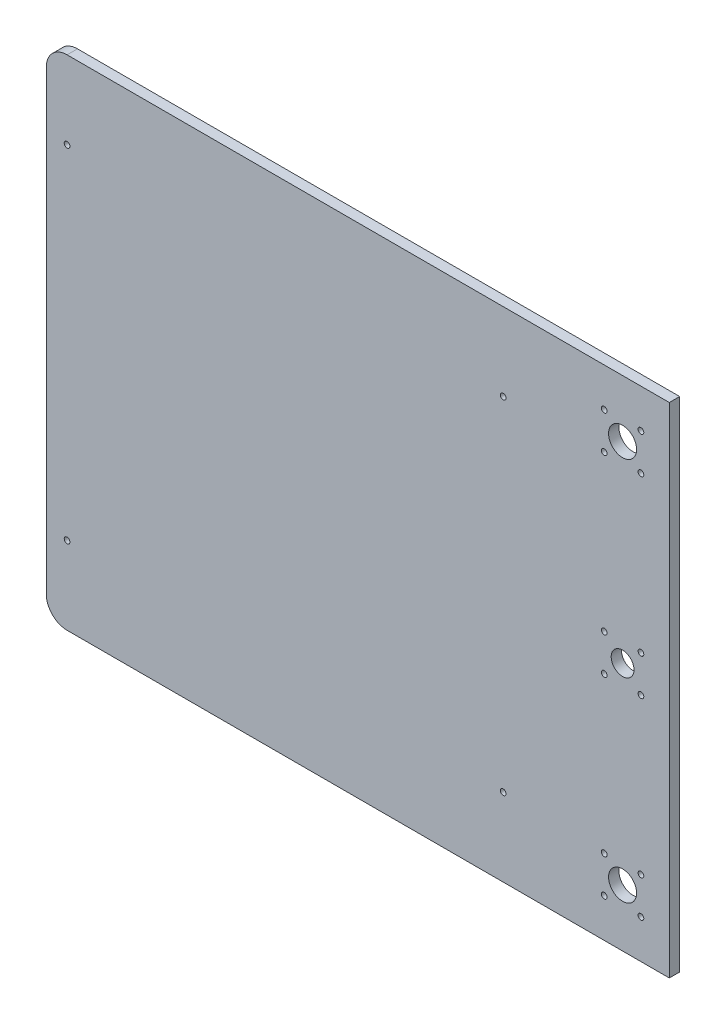
ISO-10303-21;
HEADER;
FILE_DESCRIPTION(('STEP AP214'),'2;1');
FILE_NAME('part.step','',(''),(''),'','','');
FILE_SCHEMA(('AUTOMOTIVE_DESIGN { 1 0 10303 214 1 1 1 1 }'));
ENDSEC;
DATA;
#1=APPLICATION_CONTEXT('core data for automotive mechanical design processes');
#2=APPLICATION_PROTOCOL_DEFINITION('international standard','automotive_design',2000,#1);
#3=PRODUCT_CONTEXT('',#1,'mechanical');
#4=PRODUCT('Part','Part','',(#3));
#5=PRODUCT_RELATED_PRODUCT_CATEGORY('part','',(#4));
#6=PRODUCT_DEFINITION_FORMATION('','',#4);
#7=PRODUCT_DEFINITION_CONTEXT('part definition',#1,'design');
#8=PRODUCT_DEFINITION('design','',#6,#7);
#9=PRODUCT_DEFINITION_SHAPE('','',#8);
#10=(LENGTH_UNIT() NAMED_UNIT(*) SI_UNIT(.MILLI.,.METRE.));
#11=(NAMED_UNIT(*) PLANE_ANGLE_UNIT() SI_UNIT($,.RADIAN.));
#12=(NAMED_UNIT(*) SI_UNIT($,.STERADIAN.) SOLID_ANGLE_UNIT());
#13=UNCERTAINTY_MEASURE_WITH_UNIT(LENGTH_MEASURE(1.E-05),#10,'distance_accuracy_value','');
#14=(GEOMETRIC_REPRESENTATION_CONTEXT(3) GLOBAL_UNCERTAINTY_ASSIGNED_CONTEXT((#13)) GLOBAL_UNIT_ASSIGNED_CONTEXT((#10,
#11,#12)) REPRESENTATION_CONTEXT('',''));
#15=CARTESIAN_POINT('',(0.,0.,0.));
#16=DIRECTION('',(0.,0.,1.));
#17=DIRECTION('',(1.,0.,0.));
#18=AXIS2_PLACEMENT_3D('',#15,#16,#17);
#19=CARTESIAN_POINT('',(45.,0.,10.));
#20=DIRECTION('',(1.,0.,0.));
#21=DIRECTION('',(0.,0.,-1.));
#22=AXIS2_PLACEMENT_3D('',#19,#20,#21);
#23=PLANE('',#22);
#24=DIRECTION('',(0.,-1.,0.));
#25=VECTOR('',#24,1.);
#26=CARTESIAN_POINT('',(45.,0.,0.));
#27=LINE('',#26,#25);
#28=CARTESIAN_POINT('',(45.,240.,0.));
#29=VERTEX_POINT('',#28);
#30=CARTESIAN_POINT('',(45.,-240.,0.));
#31=VERTEX_POINT('',#30);
#32=EDGE_CURVE('E115',#29,#31,#27,.T.);
#33=ORIENTED_EDGE('',*,*,#32,.F.);
#34=DIRECTION('',(0.,0.,-1.));
#35=VECTOR('',#34,1.);
#36=CARTESIAN_POINT('',(45.,240.,10.));
#37=LINE('',#36,#35);
#38=CARTESIAN_POINT('',(45.,240.,10.));
#39=VERTEX_POINT('',#38);
#40=EDGE_CURVE('E104',#39,#29,#37,.T.);
#41=ORIENTED_EDGE('',*,*,#40,.F.);
#42=DIRECTION('',(0.,-1.,0.));
#43=VECTOR('',#42,1.);
#44=CARTESIAN_POINT('',(45.,0.,10.));
#45=LINE('',#44,#43);
#46=CARTESIAN_POINT('',(45.,-240.,10.));
#47=VERTEX_POINT('',#46);
#48=EDGE_CURVE('E109',#39,#47,#45,.T.);
#49=ORIENTED_EDGE('',*,*,#48,.T.);
#50=DIRECTION('',(0.,0.,-1.));
#51=VECTOR('',#50,1.);
#52=CARTESIAN_POINT('',(45.,-240.,10.));
#53=LINE('',#52,#51);
#54=EDGE_CURVE('E117',#47,#31,#53,.T.);
#55=ORIENTED_EDGE('',*,*,#54,.T.);
#56=EDGE_LOOP('',(#33,#41,#49,#55));
#57=FACE_BOUND('',#56,.T.);
#58=ADVANCED_FACE('F48',(#57),#23,.T.);
#59=CARTESIAN_POINT('',(0.,240.,10.));
#60=DIRECTION('',(0.,1.,0.));
#61=DIRECTION('',(0.,0.,1.));
#62=AXIS2_PLACEMENT_3D('',#59,#60,#61);
#63=PLANE('',#62);
#64=DIRECTION('',(1.,0.,0.));
#65=VECTOR('',#64,1.);
#66=CARTESIAN_POINT('',(0.,240.,0.));
#67=LINE('',#66,#65);
#68=CARTESIAN_POINT('',(-535.,240.,-1.11022302462516E-13));
#69=VERTEX_POINT('',#68);
#70=EDGE_CURVE('E190',#69,#29,#67,.T.);
#71=ORIENTED_EDGE('',*,*,#70,.F.);
#72=DIRECTION('',(0.,0.,-1.));
#73=VECTOR('',#72,1.);
#74=CARTESIAN_POINT('',(-535.,240.,9.9999999999999));
#75=LINE('',#74,#73);
#76=CARTESIAN_POINT('',(-535.,240.,9.9999999999999));
#77=VERTEX_POINT('',#76);
#78=EDGE_CURVE('E71',#69,#77,#75,.F.);
#79=ORIENTED_EDGE('',*,*,#78,.T.);
#80=DIRECTION('',(1.,0.,0.));
#81=VECTOR('',#80,1.);
#82=CARTESIAN_POINT('',(0.,240.,10.));
#83=LINE('',#82,#81);
#84=EDGE_CURVE('E101',#77,#39,#83,.T.);
#85=ORIENTED_EDGE('',*,*,#84,.T.);
#86=ORIENTED_EDGE('',*,*,#40,.T.);
#87=EDGE_LOOP('',(#71,#79,#85,#86));
#88=FACE_BOUND('',#87,.T.);
#89=ADVANCED_FACE('F103',(#88),#63,.T.);
#90=CARTESIAN_POINT('',(-555.,0.,9.9999999999999));
#91=DIRECTION('',(1.,0.,0.));
#92=DIRECTION('',(0.,0.,-1.));
#93=AXIS2_PLACEMENT_3D('',#90,#91,#92);
#94=PLANE('',#93);
#95=DIRECTION('',(0.,-1.,0.));
#96=VECTOR('',#95,1.);
#97=CARTESIAN_POINT('',(-555.,0.,9.9999999999999));
#98=LINE('',#97,#96);
#99=CARTESIAN_POINT('',(-555.,220.,9.99999999999995));
#100=VERTEX_POINT('',#99);
#101=CARTESIAN_POINT('',(-555.,-220.,9.9999999999999));
#102=VERTEX_POINT('',#101);
#103=EDGE_CURVE('E108',#100,#102,#98,.T.);
#104=ORIENTED_EDGE('',*,*,#103,.F.);
#105=DIRECTION('',(0.,0.,-1.));
#106=VECTOR('',#105,1.);
#107=CARTESIAN_POINT('',(-555.,220.,0.));
#108=LINE('',#107,#106);
#109=CARTESIAN_POINT('',(-555.,220.,0.));
#110=VERTEX_POINT('',#109);
#111=EDGE_CURVE('E242',#100,#110,#108,.T.);
#112=ORIENTED_EDGE('',*,*,#111,.T.);
#113=DIRECTION('',(0.,-1.,0.));
#114=VECTOR('',#113,1.);
#115=CARTESIAN_POINT('',(-555.,0.,-1.11022302462516E-13));
#116=LINE('',#115,#114);
#117=CARTESIAN_POINT('',(-555.,-220.,-1.11022302462516E-13));
#118=VERTEX_POINT('',#117);
#119=EDGE_CURVE('E192',#110,#118,#116,.T.);
#120=ORIENTED_EDGE('',*,*,#119,.T.);
#121=DIRECTION('',(0.,0.,-1.));
#122=VECTOR('',#121,1.);
#123=CARTESIAN_POINT('',(-555.,-220.,9.9999999999999));
#124=LINE('',#123,#122);
#125=EDGE_CURVE('E116',#118,#102,#124,.F.);
#126=ORIENTED_EDGE('',*,*,#125,.T.);
#127=EDGE_LOOP('',(#104,#112,#120,#126));
#128=FACE_BOUND('',#127,.T.);
#129=ADVANCED_FACE('F254',(#128),#94,.F.);
#130=CARTESIAN_POINT('',(-2.22044604925031E-13,-185.,9.99999999999995));
#131=DIRECTION('',(0.,0.,-1.));
#132=DIRECTION('',(-1.,0.,0.));
#133=AXIS2_PLACEMENT_3D('',#130,#131,#132);
#134=CYLINDRICAL_SURFACE('',#133,13.5);
#135=CARTESIAN_POINT('',(-2.22044604925031E-13,-185.,9.99999999999995));
#136=DIRECTION('',(0.,0.,1.));
#137=DIRECTION('',(1.,0.,0.));
#138=AXIS2_PLACEMENT_3D('',#135,#136,#137);
#139=CIRCLE('',#138,13.5);
#140=CARTESIAN_POINT('',(13.4999999999998,-185.,9.99999999999995));
#141=VERTEX_POINT('',#140);
#142=EDGE_CURVE('E168',#141,#141,#139,.F.);
#143=ORIENTED_EDGE('',*,*,#142,.F.);
#144=EDGE_LOOP('',(#143));
#145=FACE_BOUND('',#144,.T.);
#146=CARTESIAN_POINT('',(-2.22044604925031E-13,-185.,0.));
#147=DIRECTION('',(0.,0.,1.));
#148=DIRECTION('',(1.,0.,0.));
#149=AXIS2_PLACEMENT_3D('',#146,#147,#148);
#150=CIRCLE('',#149,13.5);
#151=CARTESIAN_POINT('',(13.4999999999998,-185.,0.));
#152=VERTEX_POINT('',#151);
#153=EDGE_CURVE('E233',#152,#152,#150,.F.);
#154=ORIENTED_EDGE('',*,*,#153,.T.);
#155=EDGE_LOOP('',(#154));
#156=FACE_BOUND('',#155,.T.);
#157=ADVANCED_FACE('F321',(#145,#156),#134,.F.);
#158=CARTESIAN_POINT('',(17.6776695296635,-167.322330470336,10.));
#159=DIRECTION('',(0.,0.,-1.));
#160=DIRECTION('',(-1.,0.,0.));
#161=AXIS2_PLACEMENT_3D('',#158,#159,#160);
#162=CYLINDRICAL_SURFACE('',#161,2.75000000000004);
#163=CARTESIAN_POINT('',(17.6776695296635,-167.322330470336,10.));
#164=DIRECTION('',(0.,0.,1.));
#165=DIRECTION('',(1.,0.,0.));
#166=AXIS2_PLACEMENT_3D('',#163,#164,#165);
#167=CIRCLE('',#166,2.75000000000004);
#168=CARTESIAN_POINT('',(20.4276695296636,-167.322330470336,10.));
#169=VERTEX_POINT('',#168);
#170=EDGE_CURVE('E165',#169,#169,#167,.F.);
#171=ORIENTED_EDGE('',*,*,#170,.F.);
#172=EDGE_LOOP('',(#171));
#173=FACE_BOUND('',#172,.T.);
#174=CARTESIAN_POINT('',(17.6776695296635,-167.322330470336,0.));
#175=DIRECTION('',(0.,0.,1.));
#176=DIRECTION('',(1.,0.,0.));
#177=AXIS2_PLACEMENT_3D('',#174,#175,#176);
#178=CIRCLE('',#177,2.75000000000004);
#179=CARTESIAN_POINT('',(20.4276695296636,-167.322330470336,0.));
#180=VERTEX_POINT('',#179);
#181=EDGE_CURVE('E230',#180,#180,#178,.F.);
#182=ORIENTED_EDGE('',*,*,#181,.T.);
#183=EDGE_LOOP('',(#182));
#184=FACE_BOUND('',#183,.T.);
#185=ADVANCED_FACE('F324',(#173,#184),#162,.F.);
#186=CARTESIAN_POINT('',(-17.6776695296638,-202.677669529664,10.));
#187=DIRECTION('',(0.,0.,-1.));
#188=DIRECTION('',(-1.,0.,0.));
#189=AXIS2_PLACEMENT_3D('',#186,#187,#188);
#190=CYLINDRICAL_SURFACE('',#189,2.75000000000003);
#191=CARTESIAN_POINT('',(-17.6776695296638,-202.677669529664,10.));
#192=DIRECTION('',(0.,0.,1.));
#193=DIRECTION('',(1.,0.,0.));
#194=AXIS2_PLACEMENT_3D('',#191,#192,#193);
#195=CIRCLE('',#194,2.75000000000003);
#196=CARTESIAN_POINT('',(-14.9276695296637,-202.677669529664,10.));
#197=VERTEX_POINT('',#196);
#198=EDGE_CURVE('E162',#197,#197,#195,.F.);
#199=ORIENTED_EDGE('',*,*,#198,.F.);
#200=EDGE_LOOP('',(#199));
#201=FACE_BOUND('',#200,.T.);
#202=CARTESIAN_POINT('',(-17.6776695296638,-202.677669529664,0.));
#203=DIRECTION('',(0.,0.,1.));
#204=DIRECTION('',(1.,0.,0.));
#205=AXIS2_PLACEMENT_3D('',#202,#203,#204);
#206=CIRCLE('',#205,2.75000000000003);
#207=CARTESIAN_POINT('',(-14.9276695296637,-202.677669529664,0.));
#208=VERTEX_POINT('',#207);
#209=EDGE_CURVE('E227',#208,#208,#206,.F.);
#210=ORIENTED_EDGE('',*,*,#209,.T.);
#211=EDGE_LOOP('',(#210));
#212=FACE_BOUND('',#211,.T.);
#213=ADVANCED_FACE('F328',(#201,#212),#190,.F.);
#214=CARTESIAN_POINT('',(-17.6776695296637,202.677669529664,10.));
#215=DIRECTION('',(0.,0.,-1.));
#216=DIRECTION('',(-1.,0.,0.));
#217=AXIS2_PLACEMENT_3D('',#214,#215,#216);
#218=CYLINDRICAL_SURFACE('',#217,2.75000000000028);
#219=CARTESIAN_POINT('',(-17.6776695296637,202.677669529664,10.));
#220=DIRECTION('',(0.,0.,1.));
#221=DIRECTION('',(1.,0.,0.));
#222=AXIS2_PLACEMENT_3D('',#219,#220,#221);
#223=CIRCLE('',#222,2.75000000000028);
#224=CARTESIAN_POINT('',(-14.9276695296634,202.677669529664,10.));
#225=VERTEX_POINT('',#224);
#226=EDGE_CURVE('E159',#225,#225,#223,.T.);
#227=ORIENTED_EDGE('',*,*,#226,.T.);
#228=EDGE_LOOP('',(#227));
#229=FACE_BOUND('',#228,.T.);
#230=CARTESIAN_POINT('',(-17.6776695296637,202.677669529664,0.));
#231=DIRECTION('',(0.,0.,1.));
#232=DIRECTION('',(1.,0.,0.));
#233=AXIS2_PLACEMENT_3D('',#230,#231,#232);
#234=CIRCLE('',#233,2.75000000000028);
#235=CARTESIAN_POINT('',(-14.9276695296634,202.677669529664,0.));
#236=VERTEX_POINT('',#235);
#237=EDGE_CURVE('E224',#236,#236,#234,.T.);
#238=ORIENTED_EDGE('',*,*,#237,.F.);
#239=EDGE_LOOP('',(#238));
#240=FACE_BOUND('',#239,.T.);
#241=ADVANCED_FACE('F332',(#229,#240),#218,.F.);
#242=CARTESIAN_POINT('',(17.6776695296635,202.677669529664,10.));
#243=DIRECTION('',(0.,0.,-1.));
#244=DIRECTION('',(-1.,0.,0.));
#245=AXIS2_PLACEMENT_3D('',#242,#243,#244);
#246=CYLINDRICAL_SURFACE('',#245,2.75000000000004);
#247=CARTESIAN_POINT('',(17.6776695296635,202.677669529664,10.));
#248=DIRECTION('',(0.,0.,1.));
#249=DIRECTION('',(1.,0.,0.));
#250=AXIS2_PLACEMENT_3D('',#247,#248,#249);
#251=CIRCLE('',#250,2.75000000000004);
#252=CARTESIAN_POINT('',(20.4276695296636,202.677669529664,10.));
#253=VERTEX_POINT('',#252);
#254=EDGE_CURVE('E156',#253,#253,#251,.T.);
#255=ORIENTED_EDGE('',*,*,#254,.T.);
#256=EDGE_LOOP('',(#255));
#257=FACE_BOUND('',#256,.T.);
#258=CARTESIAN_POINT('',(17.6776695296635,202.677669529664,0.));
#259=DIRECTION('',(0.,0.,1.));
#260=DIRECTION('',(1.,0.,0.));
#261=AXIS2_PLACEMENT_3D('',#258,#259,#260);
#262=CIRCLE('',#261,2.75000000000004);
#263=CARTESIAN_POINT('',(20.4276695296636,202.677669529664,0.));
#264=VERTEX_POINT('',#263);
#265=EDGE_CURVE('E221',#264,#264,#262,.T.);
#266=ORIENTED_EDGE('',*,*,#265,.F.);
#267=EDGE_LOOP('',(#266));
#268=FACE_BOUND('',#267,.T.);
#269=ADVANCED_FACE('F336',(#257,#268),#246,.F.);
#270=CARTESIAN_POINT('',(17.6776695296635,167.322330470336,10.));
#271=DIRECTION('',(0.,0.,-1.));
#272=DIRECTION('',(-1.,0.,0.));
#273=AXIS2_PLACEMENT_3D('',#270,#271,#272);
#274=CYLINDRICAL_SURFACE('',#273,2.75000000000004);
#275=CARTESIAN_POINT('',(17.6776695296635,167.322330470336,10.));
#276=DIRECTION('',(0.,0.,1.));
#277=DIRECTION('',(1.,0.,0.));
#278=AXIS2_PLACEMENT_3D('',#275,#276,#277);
#279=CIRCLE('',#278,2.75000000000004);
#280=CARTESIAN_POINT('',(20.4276695296636,167.322330470336,10.));
#281=VERTEX_POINT('',#280);
#282=EDGE_CURVE('E153',#281,#281,#279,.T.);
#283=ORIENTED_EDGE('',*,*,#282,.T.);
#284=EDGE_LOOP('',(#283));
#285=FACE_BOUND('',#284,.T.);
#286=CARTESIAN_POINT('',(17.6776695296635,167.322330470336,0.));
#287=DIRECTION('',(0.,0.,1.));
#288=DIRECTION('',(1.,0.,0.));
#289=AXIS2_PLACEMENT_3D('',#286,#287,#288);
#290=CIRCLE('',#289,2.75000000000004);
#291=CARTESIAN_POINT('',(20.4276695296636,167.322330470336,0.));
#292=VERTEX_POINT('',#291);
#293=EDGE_CURVE('E218',#292,#292,#290,.T.);
#294=ORIENTED_EDGE('',*,*,#293,.F.);
#295=EDGE_LOOP('',(#294));
#296=FACE_BOUND('',#295,.T.);
#297=ADVANCED_FACE('F340',(#285,#296),#274,.F.);
#298=CARTESIAN_POINT('',(-17.6776695296637,167.322330470336,10.));
#299=DIRECTION('',(0.,0.,-1.));
#300=DIRECTION('',(-1.,0.,0.));
#301=AXIS2_PLACEMENT_3D('',#298,#299,#300);
#302=CYLINDRICAL_SURFACE('',#301,2.75000000000003);
#303=CARTESIAN_POINT('',(-17.6776695296637,167.322330470336,10.));
#304=DIRECTION('',(0.,0.,1.));
#305=DIRECTION('',(1.,0.,0.));
#306=AXIS2_PLACEMENT_3D('',#303,#304,#305);
#307=CIRCLE('',#306,2.75000000000003);
#308=CARTESIAN_POINT('',(-14.9276695296636,167.322330470336,10.));
#309=VERTEX_POINT('',#308);
#310=EDGE_CURVE('E150',#309,#309,#307,.T.);
#311=ORIENTED_EDGE('',*,*,#310,.T.);
#312=EDGE_LOOP('',(#311));
#313=FACE_BOUND('',#312,.T.);
#314=CARTESIAN_POINT('',(-17.6776695296637,167.322330470336,0.));
#315=DIRECTION('',(0.,0.,1.));
#316=DIRECTION('',(1.,0.,0.));
#317=AXIS2_PLACEMENT_3D('',#314,#315,#316);
#318=CIRCLE('',#317,2.75000000000003);
#319=CARTESIAN_POINT('',(-14.9276695296636,167.322330470336,0.));
#320=VERTEX_POINT('',#319);
#321=EDGE_CURVE('E215',#320,#320,#318,.T.);
#322=ORIENTED_EDGE('',*,*,#321,.F.);
#323=EDGE_LOOP('',(#322));
#324=FACE_BOUND('',#323,.T.);
#325=ADVANCED_FACE('F344',(#313,#324),#302,.F.);
#326=CARTESIAN_POINT('',(0.,185.,9.9999999999999));
#327=DIRECTION('',(0.,0.,-1.));
#328=DIRECTION('',(-1.,0.,0.));
#329=AXIS2_PLACEMENT_3D('',#326,#327,#328);
#330=CYLINDRICAL_SURFACE('',#329,13.5);
#331=CARTESIAN_POINT('',(0.,185.,9.9999999999999));
#332=DIRECTION('',(0.,0.,1.));
#333=DIRECTION('',(1.,0.,0.));
#334=AXIS2_PLACEMENT_3D('',#331,#332,#333);
#335=CIRCLE('',#334,13.5);
#336=CARTESIAN_POINT('',(13.5,185.,9.9999999999999));
#337=VERTEX_POINT('',#336);
#338=EDGE_CURVE('E147',#337,#337,#335,.T.);
#339=ORIENTED_EDGE('',*,*,#338,.T.);
#340=EDGE_LOOP('',(#339));
#341=FACE_BOUND('',#340,.T.);
#342=CARTESIAN_POINT('',(0.,185.,-1.11022302462516E-13));
#343=DIRECTION('',(0.,0.,1.));
#344=DIRECTION('',(1.,0.,0.));
#345=AXIS2_PLACEMENT_3D('',#342,#343,#344);
#346=CIRCLE('',#345,13.5);
#347=CARTESIAN_POINT('',(13.5,185.,-1.11022302462516E-13));
#348=VERTEX_POINT('',#347);
#349=EDGE_CURVE('E212',#348,#348,#346,.T.);
#350=ORIENTED_EDGE('',*,*,#349,.F.);
#351=EDGE_LOOP('',(#350));
#352=FACE_BOUND('',#351,.T.);
#353=ADVANCED_FACE('F348',(#341,#352),#330,.F.);
#354=CARTESIAN_POINT('',(17.6776695296635,-17.6776695296638,9.99999999999995));
#355=DIRECTION('',(0.,0.,-1.));
#356=DIRECTION('',(-1.,0.,0.));
#357=AXIS2_PLACEMENT_3D('',#354,#355,#356);
#358=CYLINDRICAL_SURFACE('',#357,2.75000000000004);
#359=CARTESIAN_POINT('',(17.6776695296635,-17.6776695296638,9.99999999999995));
#360=DIRECTION('',(0.,0.,1.));
#361=DIRECTION('',(1.,0.,0.));
#362=AXIS2_PLACEMENT_3D('',#359,#360,#361);
#363=CIRCLE('',#362,2.75000000000004);
#364=CARTESIAN_POINT('',(20.4276695296636,-17.6776695296638,9.99999999999995));
#365=VERTEX_POINT('',#364);
#366=EDGE_CURVE('E144',#365,#365,#363,.T.);
#367=ORIENTED_EDGE('',*,*,#366,.T.);
#368=EDGE_LOOP('',(#367));
#369=FACE_BOUND('',#368,.T.);
#370=CARTESIAN_POINT('',(17.6776695296635,-17.6776695296638,0.));
#371=DIRECTION('',(0.,0.,1.));
#372=DIRECTION('',(1.,0.,0.));
#373=AXIS2_PLACEMENT_3D('',#370,#371,#372);
#374=CIRCLE('',#373,2.75000000000004);
#375=CARTESIAN_POINT('',(20.4276695296636,-17.6776695296638,0.));
#376=VERTEX_POINT('',#375);
#377=EDGE_CURVE('E209',#376,#376,#374,.T.);
#378=ORIENTED_EDGE('',*,*,#377,.F.);
#379=EDGE_LOOP('',(#378));
#380=FACE_BOUND('',#379,.T.);
#381=ADVANCED_FACE('F352',(#369,#380),#358,.F.);
#382=CARTESIAN_POINT('',(-17.6776695296635,-17.6776695296638,9.99999999999995));
#383=DIRECTION('',(0.,0.,-1.));
#384=DIRECTION('',(-1.,0.,0.));
#385=AXIS2_PLACEMENT_3D('',#382,#383,#384);
#386=CYLINDRICAL_SURFACE('',#385,2.75000000000004);
#387=CARTESIAN_POINT('',(-17.6776695296635,-17.6776695296638,9.99999999999995));
#388=DIRECTION('',(0.,0.,1.));
#389=DIRECTION('',(1.,0.,0.));
#390=AXIS2_PLACEMENT_3D('',#387,#388,#389);
#391=CIRCLE('',#390,2.75000000000004);
#392=CARTESIAN_POINT('',(-14.9276695296635,-17.6776695296638,9.99999999999995));
#393=VERTEX_POINT('',#392);
#394=EDGE_CURVE('E141',#393,#393,#391,.T.);
#395=ORIENTED_EDGE('',*,*,#394,.T.);
#396=EDGE_LOOP('',(#395));
#397=FACE_BOUND('',#396,.T.);
#398=CARTESIAN_POINT('',(-17.6776695296635,-17.6776695296637,0.));
#399=DIRECTION('',(0.,0.,1.));
#400=DIRECTION('',(1.,0.,0.));
#401=AXIS2_PLACEMENT_3D('',#398,#399,#400);
#402=CIRCLE('',#401,2.75000000000004);
#403=CARTESIAN_POINT('',(-14.9276695296635,-17.6776695296637,0.));
#404=VERTEX_POINT('',#403);
#405=EDGE_CURVE('E206',#404,#404,#402,.T.);
#406=ORIENTED_EDGE('',*,*,#405,.F.);
#407=EDGE_LOOP('',(#406));
#408=FACE_BOUND('',#407,.T.);
#409=ADVANCED_FACE('F356',(#397,#408),#386,.F.);
#410=CARTESIAN_POINT('',(17.6776695296635,17.6776695296638,9.9999999999999));
#411=DIRECTION('',(0.,0.,-1.));
#412=DIRECTION('',(-1.,0.,0.));
#413=AXIS2_PLACEMENT_3D('',#410,#411,#412);
#414=CYLINDRICAL_SURFACE('',#413,2.75000000000004);
#415=CARTESIAN_POINT('',(17.6776695296635,17.6776695296638,9.9999999999999));
#416=DIRECTION('',(0.,0.,1.));
#417=DIRECTION('',(1.,0.,0.));
#418=AXIS2_PLACEMENT_3D('',#415,#416,#417);
#419=CIRCLE('',#418,2.75000000000004);
#420=CARTESIAN_POINT('',(20.4276695296636,17.6776695296638,9.9999999999999));
#421=VERTEX_POINT('',#420);
#422=EDGE_CURVE('E138',#421,#421,#419,.T.);
#423=ORIENTED_EDGE('',*,*,#422,.T.);
#424=EDGE_LOOP('',(#423));
#425=FACE_BOUND('',#424,.T.);
#426=CARTESIAN_POINT('',(17.6776695296635,17.6776695296638,-1.11022302462516E-13));
#427=DIRECTION('',(0.,0.,1.));
#428=DIRECTION('',(1.,0.,0.));
#429=AXIS2_PLACEMENT_3D('',#426,#427,#428);
#430=CIRCLE('',#429,2.75000000000004);
#431=CARTESIAN_POINT('',(20.4276695296636,17.6776695296638,-1.11022302462516E-13));
#432=VERTEX_POINT('',#431);
#433=EDGE_CURVE('E203',#432,#432,#430,.T.);
#434=ORIENTED_EDGE('',*,*,#433,.F.);
#435=EDGE_LOOP('',(#434));
#436=FACE_BOUND('',#435,.T.);
#437=ADVANCED_FACE('F360',(#425,#436),#414,.F.);
#438=CARTESIAN_POINT('',(-17.6776695296637,17.6776695296638,9.9999999999999));
#439=DIRECTION('',(0.,0.,-1.));
#440=DIRECTION('',(-1.,0.,0.));
#441=AXIS2_PLACEMENT_3D('',#438,#439,#440);
#442=CYLINDRICAL_SURFACE('',#441,2.75000000000004);
#443=CARTESIAN_POINT('',(-17.6776695296637,17.6776695296638,9.9999999999999));
#444=DIRECTION('',(0.,0.,1.));
#445=DIRECTION('',(1.,0.,0.));
#446=AXIS2_PLACEMENT_3D('',#443,#444,#445);
#447=CIRCLE('',#446,2.75000000000004);
#448=CARTESIAN_POINT('',(-14.9276695296636,17.6776695296638,9.9999999999999));
#449=VERTEX_POINT('',#448);
#450=EDGE_CURVE('E135',#449,#449,#447,.T.);
#451=ORIENTED_EDGE('',*,*,#450,.T.);
#452=EDGE_LOOP('',(#451));
#453=FACE_BOUND('',#452,.T.);
#454=CARTESIAN_POINT('',(-17.6776695296637,17.6776695296638,-1.11022302462516E-13));
#455=DIRECTION('',(0.,0.,1.));
#456=DIRECTION('',(1.,0.,0.));
#457=AXIS2_PLACEMENT_3D('',#454,#455,#456);
#458=CIRCLE('',#457,2.75000000000004);
#459=CARTESIAN_POINT('',(-14.9276695296636,17.6776695296638,-1.11022302462516E-13));
#460=VERTEX_POINT('',#459);
#461=EDGE_CURVE('E200',#460,#460,#458,.T.);
#462=ORIENTED_EDGE('',*,*,#461,.F.);
#463=EDGE_LOOP('',(#462));
#464=FACE_BOUND('',#463,.T.);
#465=ADVANCED_FACE('F277',(#453,#464),#442,.F.);
#466=CARTESIAN_POINT('',(0.,0.,10.));
#467=DIRECTION('',(0.,0.,-1.));
#468=DIRECTION('',(-1.,0.,0.));
#469=AXIS2_PLACEMENT_3D('',#466,#467,#468);
#470=CYLINDRICAL_SURFACE('',#469,11.);
#471=CARTESIAN_POINT('',(0.,0.,10.));
#472=DIRECTION('',(0.,0.,1.));
#473=DIRECTION('',(1.,0.,0.));
#474=AXIS2_PLACEMENT_3D('',#471,#472,#473);
#475=CIRCLE('',#474,11.);
#476=CARTESIAN_POINT('',(11.,0.,10.));
#477=VERTEX_POINT('',#476);
#478=EDGE_CURVE('E132',#477,#477,#475,.T.);
#479=ORIENTED_EDGE('',*,*,#478,.T.);
#480=EDGE_LOOP('',(#479));
#481=FACE_BOUND('',#480,.T.);
#482=CARTESIAN_POINT('',(0.,0.,0.));
#483=DIRECTION('',(0.,0.,1.));
#484=DIRECTION('',(1.,0.,0.));
#485=AXIS2_PLACEMENT_3D('',#482,#483,#484);
#486=CIRCLE('',#485,11.);
#487=CARTESIAN_POINT('',(11.,0.,0.));
#488=VERTEX_POINT('',#487);
#489=EDGE_CURVE('E197',#488,#488,#486,.T.);
#490=ORIENTED_EDGE('',*,*,#489,.F.);
#491=EDGE_LOOP('',(#490));
#492=FACE_BOUND('',#491,.T.);
#493=ADVANCED_FACE('F268',(#481,#492),#470,.F.);
#494=CARTESIAN_POINT('',(-2.22044604925031E-13,-240.,10.));
#495=DIRECTION('',(0.,1.,0.));
#496=DIRECTION('',(0.,0.,1.));
#497=AXIS2_PLACEMENT_3D('',#494,#495,#496);
#498=PLANE('',#497);
#499=DIRECTION('',(1.,0.,0.));
#500=VECTOR('',#499,1.);
#501=CARTESIAN_POINT('',(-2.22044604925031E-13,-240.,10.));
#502=LINE('',#501,#500);
#503=CARTESIAN_POINT('',(-535.,-240.,9.9999999999999));
#504=VERTEX_POINT('',#503);
#505=EDGE_CURVE('E121',#504,#47,#502,.T.);
#506=ORIENTED_EDGE('',*,*,#505,.F.);
#507=DIRECTION('',(0.,0.,-1.));
#508=VECTOR('',#507,1.);
#509=CARTESIAN_POINT('',(-535.,-240.,9.9999999999999));
#510=LINE('',#509,#508);
#511=CARTESIAN_POINT('',(-535.,-240.,-1.11022302462516E-13));
#512=VERTEX_POINT('',#511);
#513=EDGE_CURVE('E13',#504,#512,#510,.T.);
#514=ORIENTED_EDGE('',*,*,#513,.T.);
#515=DIRECTION('',(1.,0.,0.));
#516=VECTOR('',#515,1.);
#517=CARTESIAN_POINT('',(-2.22044604925031E-13,-240.,0.));
#518=LINE('',#517,#516);
#519=EDGE_CURVE('E195',#512,#31,#518,.T.);
#520=ORIENTED_EDGE('',*,*,#519,.T.);
#521=ORIENTED_EDGE('',*,*,#54,.F.);
#522=EDGE_LOOP('',(#506,#514,#520,#521));
#523=FACE_BOUND('',#522,.T.);
#524=ADVANCED_FACE('F265',(#523),#498,.F.);
#525=CARTESIAN_POINT('',(17.6776695296635,-202.677669529664,10.));
#526=DIRECTION('',(0.,0.,-1.));
#527=DIRECTION('',(-1.,0.,0.));
#528=AXIS2_PLACEMENT_3D('',#525,#526,#527);
#529=CYLINDRICAL_SURFACE('',#528,2.75000000000004);
#530=CARTESIAN_POINT('',(17.6776695296635,-202.677669529664,10.));
#531=DIRECTION('',(0.,0.,1.));
#532=DIRECTION('',(1.,0.,0.));
#533=AXIS2_PLACEMENT_3D('',#530,#531,#532);
#534=CIRCLE('',#533,2.75000000000004);
#535=CARTESIAN_POINT('',(20.4276695296636,-202.677669529664,10.));
#536=VERTEX_POINT('',#535);
#537=EDGE_CURVE('E123',#536,#536,#534,.F.);
#538=ORIENTED_EDGE('',*,*,#537,.F.);
#539=EDGE_LOOP('',(#538));
#540=FACE_BOUND('',#539,.T.);
#541=CARTESIAN_POINT('',(17.6776695296635,-202.677669529664,0.));
#542=DIRECTION('',(0.,0.,1.));
#543=DIRECTION('',(1.,0.,0.));
#544=AXIS2_PLACEMENT_3D('',#541,#542,#543);
#545=CIRCLE('',#544,2.75000000000004);
#546=CARTESIAN_POINT('',(20.4276695296636,-202.677669529664,0.));
#547=VERTEX_POINT('',#546);
#548=EDGE_CURVE('E186',#547,#547,#545,.F.);
#549=ORIENTED_EDGE('',*,*,#548,.T.);
#550=EDGE_LOOP('',(#549));
#551=FACE_BOUND('',#550,.T.);
#552=ADVANCED_FACE('F267',(#540,#551),#529,.F.);
#553=CARTESIAN_POINT('',(-17.6776695296635,-167.322330470336,10.));
#554=DIRECTION('',(0.,0.,-1.));
#555=DIRECTION('',(-1.,0.,0.));
#556=AXIS2_PLACEMENT_3D('',#553,#554,#555);
#557=CYLINDRICAL_SURFACE('',#556,2.75000000000003);
#558=CARTESIAN_POINT('',(-17.6776695296635,-167.322330470336,10.));
#559=DIRECTION('',(0.,0.,1.));
#560=DIRECTION('',(1.,0.,0.));
#561=AXIS2_PLACEMENT_3D('',#558,#559,#560);
#562=CIRCLE('',#561,2.75000000000003);
#563=CARTESIAN_POINT('',(-14.9276695296635,-167.322330470336,10.));
#564=VERTEX_POINT('',#563);
#565=EDGE_CURVE('E126',#564,#564,#562,.F.);
#566=ORIENTED_EDGE('',*,*,#565,.F.);
#567=EDGE_LOOP('',(#566));
#568=FACE_BOUND('',#567,.T.);
#569=CARTESIAN_POINT('',(-17.6776695296635,-167.322330470336,0.));
#570=DIRECTION('',(0.,0.,1.));
#571=DIRECTION('',(1.,0.,0.));
#572=AXIS2_PLACEMENT_3D('',#569,#570,#571);
#573=CIRCLE('',#572,2.75000000000003);
#574=CARTESIAN_POINT('',(-14.9276695296635,-167.322330470336,0.));
#575=VERTEX_POINT('',#574);
#576=EDGE_CURVE('E183',#575,#575,#573,.F.);
#577=ORIENTED_EDGE('',*,*,#576,.T.);
#578=EDGE_LOOP('',(#577));
#579=FACE_BOUND('',#578,.T.);
#580=ADVANCED_FACE('F274',(#568,#579),#557,.F.);
#581=CARTESIAN_POINT('',(-535.,165.,9.9999999999999));
#582=DIRECTION('',(0.,0.,-1.));
#583=DIRECTION('',(-1.,0.,0.));
#584=AXIS2_PLACEMENT_3D('',#581,#582,#583);
#585=CYLINDRICAL_SURFACE('',#584,2.75000000000004);
#586=CARTESIAN_POINT('',(-535.,165.,9.9999999999999));
#587=DIRECTION('',(0.,0.,1.));
#588=DIRECTION('',(1.,0.,0.));
#589=AXIS2_PLACEMENT_3D('',#586,#587,#588);
#590=CIRCLE('',#589,2.75000000000004);
#591=CARTESIAN_POINT('',(-532.25,165.,9.9999999999999));
#592=VERTEX_POINT('',#591);
#593=EDGE_CURVE('E561',#592,#592,#590,.T.);
#594=ORIENTED_EDGE('',*,*,#593,.T.);
#595=EDGE_LOOP('',(#594));
#596=FACE_BOUND('',#595,.T.);
#597=CARTESIAN_POINT('',(-535.,165.,-1.11022302462516E-13));
#598=DIRECTION('',(0.,0.,1.));
#599=DIRECTION('',(1.,0.,0.));
#600=AXIS2_PLACEMENT_3D('',#597,#598,#599);
#601=CIRCLE('',#600,2.75000000000004);
#602=CARTESIAN_POINT('',(-532.25,165.,-1.11022302462516E-13));
#603=VERTEX_POINT('',#602);
#604=EDGE_CURVE('E180',#603,#603,#601,.T.);
#605=ORIENTED_EDGE('',*,*,#604,.F.);
#606=EDGE_LOOP('',(#605));
#607=FACE_BOUND('',#606,.T.);
#608=ADVANCED_FACE('F290',(#596,#607),#585,.F.);
#609=CARTESIAN_POINT('',(-115.,165.,10.));
#610=DIRECTION('',(0.,0.,-1.));
#611=DIRECTION('',(-1.,0.,0.));
#612=AXIS2_PLACEMENT_3D('',#609,#610,#611);
#613=CYLINDRICAL_SURFACE('',#612,2.75000000000001);
#614=CARTESIAN_POINT('',(-115.,165.,10.));
#615=DIRECTION('',(0.,0.,1.));
#616=DIRECTION('',(1.,0.,0.));
#617=AXIS2_PLACEMENT_3D('',#614,#615,#616);
#618=CIRCLE('',#617,2.75000000000001);
#619=CARTESIAN_POINT('',(-112.25,165.,10.));
#620=VERTEX_POINT('',#619);
#621=EDGE_CURVE('E557',#620,#620,#618,.T.);
#622=ORIENTED_EDGE('',*,*,#621,.T.);
#623=EDGE_LOOP('',(#622));
#624=FACE_BOUND('',#623,.T.);
#625=CARTESIAN_POINT('',(-115.,165.,0.));
#626=DIRECTION('',(0.,0.,1.));
#627=DIRECTION('',(1.,0.,0.));
#628=AXIS2_PLACEMENT_3D('',#625,#626,#627);
#629=CIRCLE('',#628,2.75000000000001);
#630=CARTESIAN_POINT('',(-112.25,165.,0.));
#631=VERTEX_POINT('',#630);
#632=EDGE_CURVE('E177',#631,#631,#629,.T.);
#633=ORIENTED_EDGE('',*,*,#632,.F.);
#634=EDGE_LOOP('',(#633));
#635=FACE_BOUND('',#634,.T.);
#636=ADVANCED_FACE('F294',(#624,#635),#613,.F.);
#637=CARTESIAN_POINT('',(-115.,-165.,10.));
#638=DIRECTION('',(0.,0.,-1.));
#639=DIRECTION('',(-1.,0.,0.));
#640=AXIS2_PLACEMENT_3D('',#637,#638,#639);
#641=CYLINDRICAL_SURFACE('',#640,2.75000000000001);
#642=CARTESIAN_POINT('',(-115.,-165.,10.));
#643=DIRECTION('',(0.,0.,1.));
#644=DIRECTION('',(1.,0.,0.));
#645=AXIS2_PLACEMENT_3D('',#642,#643,#644);
#646=CIRCLE('',#645,2.75000000000001);
#647=CARTESIAN_POINT('',(-112.25,-165.,10.));
#648=VERTEX_POINT('',#647);
#649=EDGE_CURVE('E239',#648,#648,#646,.F.);
#650=ORIENTED_EDGE('',*,*,#649,.F.);
#651=EDGE_LOOP('',(#650));
#652=FACE_BOUND('',#651,.T.);
#653=CARTESIAN_POINT('',(-115.,-165.,0.));
#654=DIRECTION('',(0.,0.,1.));
#655=DIRECTION('',(1.,0.,0.));
#656=AXIS2_PLACEMENT_3D('',#653,#654,#655);
#657=CIRCLE('',#656,2.75000000000001);
#658=CARTESIAN_POINT('',(-112.25,-165.,0.));
#659=VERTEX_POINT('',#658);
#660=EDGE_CURVE('E174',#659,#659,#657,.F.);
#661=ORIENTED_EDGE('',*,*,#660,.T.);
#662=EDGE_LOOP('',(#661));
#663=FACE_BOUND('',#662,.T.);
#664=ADVANCED_FACE('F298',(#652,#663),#641,.F.);
#665=CARTESIAN_POINT('',(-535.,-165.,10.));
#666=DIRECTION('',(0.,0.,-1.));
#667=DIRECTION('',(-1.,0.,0.));
#668=AXIS2_PLACEMENT_3D('',#665,#666,#667);
#669=CYLINDRICAL_SURFACE('',#668,2.75000000000004);
#670=CARTESIAN_POINT('',(-535.,-165.,10.));
#671=DIRECTION('',(0.,0.,1.));
#672=DIRECTION('',(1.,0.,0.));
#673=AXIS2_PLACEMENT_3D('',#670,#671,#672);
#674=CIRCLE('',#673,2.75000000000004);
#675=CARTESIAN_POINT('',(-532.25,-165.,10.));
#676=VERTEX_POINT('',#675);
#677=EDGE_CURVE('E171',#676,#676,#674,.F.);
#678=ORIENTED_EDGE('',*,*,#677,.F.);
#679=EDGE_LOOP('',(#678));
#680=FACE_BOUND('',#679,.T.);
#681=CARTESIAN_POINT('',(-535.,-165.,0.));
#682=DIRECTION('',(0.,0.,1.));
#683=DIRECTION('',(1.,0.,0.));
#684=AXIS2_PLACEMENT_3D('',#681,#682,#683);
#685=CIRCLE('',#684,2.75000000000004);
#686=CARTESIAN_POINT('',(-532.25,-165.,0.));
#687=VERTEX_POINT('',#686);
#688=EDGE_CURVE('E236',#687,#687,#685,.F.);
#689=ORIENTED_EDGE('',*,*,#688,.T.);
#690=EDGE_LOOP('',(#689));
#691=FACE_BOUND('',#690,.T.);
#692=ADVANCED_FACE('F301',(#680,#691),#669,.F.);
#693=CARTESIAN_POINT('',(0.,0.,10.));
#694=DIRECTION('',(0.,0.,1.));
#695=DIRECTION('',(1.,0.,0.));
#696=AXIS2_PLACEMENT_3D('',#693,#694,#695);
#697=PLANE('',#696);
#698=ORIENTED_EDGE('',*,*,#649,.T.);
#699=EDGE_LOOP('',(#698));
#700=FACE_BOUND('',#699,.T.);
#701=ORIENTED_EDGE('',*,*,#621,.F.);
#702=EDGE_LOOP('',(#701));
#703=FACE_BOUND('',#702,.T.);
#704=ORIENTED_EDGE('',*,*,#593,.F.);
#705=EDGE_LOOP('',(#704));
#706=FACE_BOUND('',#705,.T.);
#707=ORIENTED_EDGE('',*,*,#565,.T.);
#708=EDGE_LOOP('',(#707));
#709=FACE_BOUND('',#708,.T.);
#710=ORIENTED_EDGE('',*,*,#537,.T.);
#711=EDGE_LOOP('',(#710));
#712=FACE_BOUND('',#711,.T.);
#713=ORIENTED_EDGE('',*,*,#84,.F.);
#714=CARTESIAN_POINT('',(-535.,220.,9.99999999999995));
#715=DIRECTION('',(0.,0.,1.));
#716=DIRECTION('',(1.,0.,0.));
#717=AXIS2_PLACEMENT_3D('',#714,#715,#716);
#718=CIRCLE('',#717,20.);
#719=EDGE_CURVE('E56',#77,#100,#718,.T.);
#720=ORIENTED_EDGE('',*,*,#719,.T.);
#721=ORIENTED_EDGE('',*,*,#103,.T.);
#722=CARTESIAN_POINT('',(-535.,-220.,9.9999999999999));
#723=DIRECTION('',(0.,0.,1.));
#724=DIRECTION('',(1.,0.,0.));
#725=AXIS2_PLACEMENT_3D('',#722,#723,#724);
#726=CIRCLE('',#725,20.);
#727=EDGE_CURVE('E63',#102,#504,#726,.T.);
#728=ORIENTED_EDGE('',*,*,#727,.T.);
#729=ORIENTED_EDGE('',*,*,#505,.T.);
#730=ORIENTED_EDGE('',*,*,#48,.F.);
#731=EDGE_LOOP('',(#713,#720,#721,#728,#729,#730));
#732=FACE_BOUND('',#731,.T.);
#733=ORIENTED_EDGE('',*,*,#478,.F.);
#734=EDGE_LOOP('',(#733));
#735=FACE_BOUND('',#734,.T.);
#736=ORIENTED_EDGE('',*,*,#450,.F.);
#737=EDGE_LOOP('',(#736));
#738=FACE_BOUND('',#737,.T.);
#739=ORIENTED_EDGE('',*,*,#422,.F.);
#740=EDGE_LOOP('',(#739));
#741=FACE_BOUND('',#740,.T.);
#742=ORIENTED_EDGE('',*,*,#394,.F.);
#743=EDGE_LOOP('',(#742));
#744=FACE_BOUND('',#743,.T.);
#745=ORIENTED_EDGE('',*,*,#366,.F.);
#746=EDGE_LOOP('',(#745));
#747=FACE_BOUND('',#746,.T.);
#748=ORIENTED_EDGE('',*,*,#338,.F.);
#749=EDGE_LOOP('',(#748));
#750=FACE_BOUND('',#749,.T.);
#751=ORIENTED_EDGE('',*,*,#310,.F.);
#752=EDGE_LOOP('',(#751));
#753=FACE_BOUND('',#752,.T.);
#754=ORIENTED_EDGE('',*,*,#282,.F.);
#755=EDGE_LOOP('',(#754));
#756=FACE_BOUND('',#755,.T.);
#757=ORIENTED_EDGE('',*,*,#254,.F.);
#758=EDGE_LOOP('',(#757));
#759=FACE_BOUND('',#758,.T.);
#760=ORIENTED_EDGE('',*,*,#226,.F.);
#761=EDGE_LOOP('',(#760));
#762=FACE_BOUND('',#761,.T.);
#763=ORIENTED_EDGE('',*,*,#198,.T.);
#764=EDGE_LOOP('',(#763));
#765=FACE_BOUND('',#764,.T.);
#766=ORIENTED_EDGE('',*,*,#170,.T.);
#767=EDGE_LOOP('',(#766));
#768=FACE_BOUND('',#767,.T.);
#769=ORIENTED_EDGE('',*,*,#142,.T.);
#770=EDGE_LOOP('',(#769));
#771=FACE_BOUND('',#770,.T.);
#772=ORIENTED_EDGE('',*,*,#677,.T.);
#773=EDGE_LOOP('',(#772));
#774=FACE_BOUND('',#773,.T.);
#775=ADVANCED_FACE('F119',(#700,#703,#706,#709,#712,#732,#735,#738,#741,#744,#747,#750,#753,
#756,#759,#762,#765,#768,#771,#774),#697,.T.);
#776=CARTESIAN_POINT('',(0.,0.,0.));
#777=DIRECTION('',(0.,0.,1.));
#778=DIRECTION('',(1.,0.,0.));
#779=AXIS2_PLACEMENT_3D('',#776,#777,#778);
#780=PLANE('',#779);
#781=ORIENTED_EDGE('',*,*,#660,.F.);
#782=EDGE_LOOP('',(#781));
#783=FACE_BOUND('',#782,.T.);
#784=ORIENTED_EDGE('',*,*,#632,.T.);
#785=EDGE_LOOP('',(#784));
#786=FACE_BOUND('',#785,.T.);
#787=ORIENTED_EDGE('',*,*,#604,.T.);
#788=EDGE_LOOP('',(#787));
#789=FACE_BOUND('',#788,.T.);
#790=ORIENTED_EDGE('',*,*,#576,.F.);
#791=EDGE_LOOP('',(#790));
#792=FACE_BOUND('',#791,.T.);
#793=ORIENTED_EDGE('',*,*,#548,.F.);
#794=EDGE_LOOP('',(#793));
#795=FACE_BOUND('',#794,.T.);
#796=ORIENTED_EDGE('',*,*,#119,.F.);
#797=CARTESIAN_POINT('',(-535.,220.,0.));
#798=DIRECTION('',(0.,0.,1.));
#799=DIRECTION('',(1.,0.,0.));
#800=AXIS2_PLACEMENT_3D('',#797,#798,#799);
#801=CIRCLE('',#800,20.);
#802=EDGE_CURVE('E247',#110,#69,#801,.F.);
#803=ORIENTED_EDGE('',*,*,#802,.T.);
#804=ORIENTED_EDGE('',*,*,#70,.T.);
#805=ORIENTED_EDGE('',*,*,#32,.T.);
#806=ORIENTED_EDGE('',*,*,#519,.F.);
#807=CARTESIAN_POINT('',(-535.,-220.,-1.11022302462516E-13));
#808=DIRECTION('',(0.,0.,1.));
#809=DIRECTION('',(1.,0.,0.));
#810=AXIS2_PLACEMENT_3D('',#807,#808,#809);
#811=CIRCLE('',#810,20.);
#812=EDGE_CURVE('E245',#512,#118,#811,.F.);
#813=ORIENTED_EDGE('',*,*,#812,.T.);
#814=EDGE_LOOP('',(#796,#803,#804,#805,#806,#813));
#815=FACE_BOUND('',#814,.T.);
#816=ORIENTED_EDGE('',*,*,#489,.T.);
#817=EDGE_LOOP('',(#816));
#818=FACE_BOUND('',#817,.T.);
#819=ORIENTED_EDGE('',*,*,#461,.T.);
#820=EDGE_LOOP('',(#819));
#821=FACE_BOUND('',#820,.T.);
#822=ORIENTED_EDGE('',*,*,#433,.T.);
#823=EDGE_LOOP('',(#822));
#824=FACE_BOUND('',#823,.T.);
#825=ORIENTED_EDGE('',*,*,#405,.T.);
#826=EDGE_LOOP('',(#825));
#827=FACE_BOUND('',#826,.T.);
#828=ORIENTED_EDGE('',*,*,#377,.T.);
#829=EDGE_LOOP('',(#828));
#830=FACE_BOUND('',#829,.T.);
#831=ORIENTED_EDGE('',*,*,#349,.T.);
#832=EDGE_LOOP('',(#831));
#833=FACE_BOUND('',#832,.T.);
#834=ORIENTED_EDGE('',*,*,#321,.T.);
#835=EDGE_LOOP('',(#834));
#836=FACE_BOUND('',#835,.T.);
#837=ORIENTED_EDGE('',*,*,#293,.T.);
#838=EDGE_LOOP('',(#837));
#839=FACE_BOUND('',#838,.T.);
#840=ORIENTED_EDGE('',*,*,#265,.T.);
#841=EDGE_LOOP('',(#840));
#842=FACE_BOUND('',#841,.T.);
#843=ORIENTED_EDGE('',*,*,#237,.T.);
#844=EDGE_LOOP('',(#843));
#845=FACE_BOUND('',#844,.T.);
#846=ORIENTED_EDGE('',*,*,#209,.F.);
#847=EDGE_LOOP('',(#846));
#848=FACE_BOUND('',#847,.T.);
#849=ORIENTED_EDGE('',*,*,#181,.F.);
#850=EDGE_LOOP('',(#849));
#851=FACE_BOUND('',#850,.T.);
#852=ORIENTED_EDGE('',*,*,#153,.F.);
#853=EDGE_LOOP('',(#852));
#854=FACE_BOUND('',#853,.T.);
#855=ORIENTED_EDGE('',*,*,#688,.F.);
#856=EDGE_LOOP('',(#855));
#857=FACE_BOUND('',#856,.T.);
#858=ADVANCED_FACE('F259',(#783,#786,#789,#792,#795,#815,#818,#821,#824,#827,#830,#833,#836,
#839,#842,#845,#848,#851,#854,#857),#780,.F.);
#859=CARTESIAN_POINT('',(-535.,220.,9.99999999999995));
#860=DIRECTION('',(0.,0.,1.));
#861=DIRECTION('',(1.,0.,0.));
#862=AXIS2_PLACEMENT_3D('',#859,#860,#861);
#863=CYLINDRICAL_SURFACE('',#862,20.);
#864=ORIENTED_EDGE('',*,*,#719,.F.);
#865=ORIENTED_EDGE('',*,*,#78,.F.);
#866=ORIENTED_EDGE('',*,*,#802,.F.);
#867=ORIENTED_EDGE('',*,*,#111,.F.);
#868=EDGE_LOOP('',(#864,#865,#866,#867));
#869=FACE_BOUND('',#868,.T.);
#870=ADVANCED_FACE('F257',(#869),#863,.T.);
#871=CARTESIAN_POINT('',(-535.,-220.,9.9999999999999));
#872=DIRECTION('',(0.,0.,-1.));
#873=DIRECTION('',(-1.,0.,0.));
#874=AXIS2_PLACEMENT_3D('',#871,#872,#873);
#875=CYLINDRICAL_SURFACE('',#874,20.);
#876=ORIENTED_EDGE('',*,*,#727,.F.);
#877=ORIENTED_EDGE('',*,*,#125,.F.);
#878=ORIENTED_EDGE('',*,*,#812,.F.);
#879=ORIENTED_EDGE('',*,*,#513,.F.);
#880=EDGE_LOOP('',(#876,#877,#878,#879));
#881=FACE_BOUND('',#880,.T.);
#882=ADVANCED_FACE('F50',(#881),#875,.T.);
#883=CLOSED_SHELL('',(#58,#89,#129,#157,#185,#213,#241,#269,#297,#325,#353,#381,#409,#437,#465,
#493,#524,#552,#580,#608,#636,#664,#692,#775,#858,#870,#882));
#884=MANIFOLD_SOLID_BREP('B2',#883);
#885=ADVANCED_BREP_SHAPE_REPRESENTATION('',(#18,#884),#14);
#886=SHAPE_DEFINITION_REPRESENTATION(#9,#885);
ENDSEC;
END-ISO-10303-21;
